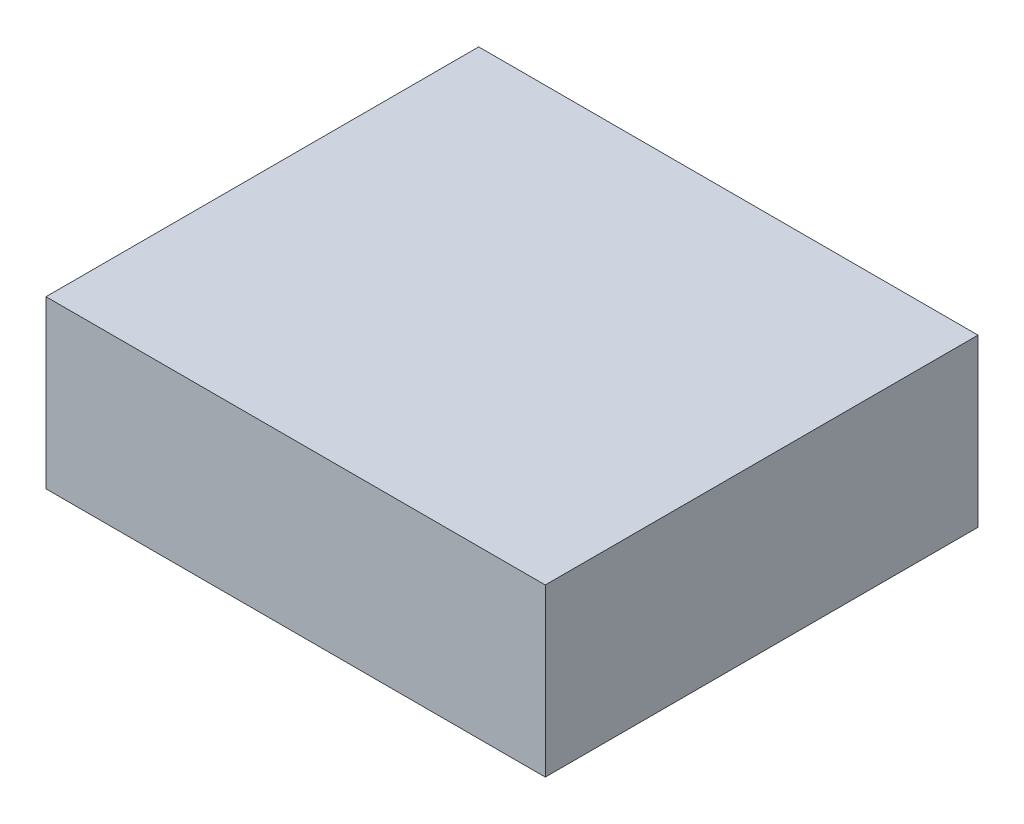
ISO-10303-21;
HEADER;
FILE_DESCRIPTION(('STEP AP214'),'2;1');
FILE_NAME('part.step','',(''),(''),'','','');
FILE_SCHEMA(('AUTOMOTIVE_DESIGN { 1 0 10303 214 1 1 1 1 }'));
ENDSEC;
DATA;
#1=APPLICATION_CONTEXT('core data for automotive mechanical design processes');
#2=APPLICATION_PROTOCOL_DEFINITION('international standard','automotive_design',2000,#1);
#3=PRODUCT_CONTEXT('',#1,'mechanical');
#4=PRODUCT('Part','Part','',(#3));
#5=PRODUCT_RELATED_PRODUCT_CATEGORY('part','',(#4));
#6=PRODUCT_DEFINITION_FORMATION('','',#4);
#7=PRODUCT_DEFINITION_CONTEXT('part definition',#1,'design');
#8=PRODUCT_DEFINITION('design','',#6,#7);
#9=PRODUCT_DEFINITION_SHAPE('','',#8);
#10=(LENGTH_UNIT() NAMED_UNIT(*) SI_UNIT(.MILLI.,.METRE.));
#11=(NAMED_UNIT(*) PLANE_ANGLE_UNIT() SI_UNIT($,.RADIAN.));
#12=(NAMED_UNIT(*) SI_UNIT($,.STERADIAN.) SOLID_ANGLE_UNIT());
#13=UNCERTAINTY_MEASURE_WITH_UNIT(LENGTH_MEASURE(1.E-05),#10,'distance_accuracy_value','');
#14=(GEOMETRIC_REPRESENTATION_CONTEXT(3) GLOBAL_UNCERTAINTY_ASSIGNED_CONTEXT((#13)) GLOBAL_UNIT_ASSIGNED_CONTEXT((#10,
#11,#12)) REPRESENTATION_CONTEXT('',''));
#15=CARTESIAN_POINT('',(0.,0.,0.));
#16=DIRECTION('',(0.,0.,1.));
#17=DIRECTION('',(1.,0.,0.));
#18=AXIS2_PLACEMENT_3D('',#15,#16,#17);
#19=CARTESIAN_POINT('',(30.,20.,26.));
#20=DIRECTION('',(-1.,0.,0.));
#21=DIRECTION('',(0.,0.,1.));
#22=AXIS2_PLACEMENT_3D('',#19,#20,#21);
#23=PLANE('',#22);
#24=DIRECTION('',(0.,0.,-1.));
#25=VECTOR('',#24,1.);
#26=CARTESIAN_POINT('',(30.,0.,26.));
#27=LINE('',#26,#25);
#28=CARTESIAN_POINT('',(30.,0.,26.));
#29=VERTEX_POINT('',#28);
#30=CARTESIAN_POINT('',(30.,0.,-26.));
#31=VERTEX_POINT('',#30);
#32=EDGE_CURVE('E96',#29,#31,#27,.T.);
#33=ORIENTED_EDGE('',*,*,#32,.T.);
#34=DIRECTION('',(0.,-1.,0.));
#35=VECTOR('',#34,1.);
#36=CARTESIAN_POINT('',(30.,20.,-26.));
#37=LINE('',#36,#35);
#38=CARTESIAN_POINT('',(30.,20.,-26.));
#39=VERTEX_POINT('',#38);
#40=EDGE_CURVE('E11',#39,#31,#37,.T.);
#41=ORIENTED_EDGE('',*,*,#40,.F.);
#42=DIRECTION('',(0.,0.,-1.));
#43=VECTOR('',#42,1.);
#44=CARTESIAN_POINT('',(30.,20.,26.));
#45=LINE('',#44,#43);
#46=CARTESIAN_POINT('',(30.,20.,26.));
#47=VERTEX_POINT('',#46);
#48=EDGE_CURVE('E84',#47,#39,#45,.T.);
#49=ORIENTED_EDGE('',*,*,#48,.F.);
#50=DIRECTION('',(0.,-1.,0.));
#51=VECTOR('',#50,1.);
#52=CARTESIAN_POINT('',(30.,20.,26.));
#53=LINE('',#52,#51);
#54=EDGE_CURVE('E92',#47,#29,#53,.T.);
#55=ORIENTED_EDGE('',*,*,#54,.T.);
#56=EDGE_LOOP('',(#33,#41,#49,#55));
#57=FACE_BOUND('',#56,.T.);
#58=ADVANCED_FACE('F33',(#57),#23,.F.);
#59=CARTESIAN_POINT('',(-30.,20.,-26.));
#60=DIRECTION('',(0.,0.,1.));
#61=DIRECTION('',(1.,0.,0.));
#62=AXIS2_PLACEMENT_3D('',#59,#60,#61);
#63=PLANE('',#62);
#64=DIRECTION('',(-1.,0.,0.));
#65=VECTOR('',#64,1.);
#66=CARTESIAN_POINT('',(-30.,0.,-26.));
#67=LINE('',#66,#65);
#68=CARTESIAN_POINT('',(-30.,0.,-26.));
#69=VERTEX_POINT('',#68);
#70=EDGE_CURVE('E88',#31,#69,#67,.T.);
#71=ORIENTED_EDGE('',*,*,#70,.T.);
#72=DIRECTION('',(0.,-1.,0.));
#73=VECTOR('',#72,1.);
#74=CARTESIAN_POINT('',(-30.,20.,-26.));
#75=LINE('',#74,#73);
#76=CARTESIAN_POINT('',(-30.,20.,-26.));
#77=VERTEX_POINT('',#76);
#78=EDGE_CURVE('E41',#77,#69,#75,.T.);
#79=ORIENTED_EDGE('',*,*,#78,.F.);
#80=DIRECTION('',(-1.,0.,0.));
#81=VECTOR('',#80,1.);
#82=CARTESIAN_POINT('',(-30.,20.,-26.));
#83=LINE('',#82,#81);
#84=EDGE_CURVE('E79',#39,#77,#83,.T.);
#85=ORIENTED_EDGE('',*,*,#84,.F.);
#86=ORIENTED_EDGE('',*,*,#40,.T.);
#87=EDGE_LOOP('',(#71,#79,#85,#86));
#88=FACE_BOUND('',#87,.T.);
#89=ADVANCED_FACE('F87',(#88),#63,.F.);
#90=CARTESIAN_POINT('',(-30.,20.,26.));
#91=DIRECTION('',(1.,0.,0.));
#92=DIRECTION('',(0.,0.,-1.));
#93=AXIS2_PLACEMENT_3D('',#90,#91,#92);
#94=PLANE('',#93);
#95=DIRECTION('',(0.,0.,1.));
#96=VECTOR('',#95,1.);
#97=CARTESIAN_POINT('',(-30.,0.,26.));
#98=LINE('',#97,#96);
#99=CARTESIAN_POINT('',(-30.,0.,26.));
#100=VERTEX_POINT('',#99);
#101=EDGE_CURVE('E66',#69,#100,#98,.T.);
#102=ORIENTED_EDGE('',*,*,#101,.T.);
#103=DIRECTION('',(0.,-1.,0.));
#104=VECTOR('',#103,1.);
#105=CARTESIAN_POINT('',(-30.,20.,26.));
#106=LINE('',#105,#104);
#107=CARTESIAN_POINT('',(-30.,20.,26.));
#108=VERTEX_POINT('',#107);
#109=EDGE_CURVE('E89',#108,#100,#106,.T.);
#110=ORIENTED_EDGE('',*,*,#109,.F.);
#111=DIRECTION('',(0.,0.,1.));
#112=VECTOR('',#111,1.);
#113=CARTESIAN_POINT('',(-30.,20.,26.));
#114=LINE('',#113,#112);
#115=EDGE_CURVE('E82',#77,#108,#114,.T.);
#116=ORIENTED_EDGE('',*,*,#115,.F.);
#117=ORIENTED_EDGE('',*,*,#78,.T.);
#118=EDGE_LOOP('',(#102,#110,#116,#117));
#119=FACE_BOUND('',#118,.T.);
#120=ADVANCED_FACE('F90',(#119),#94,.F.);
#121=CARTESIAN_POINT('',(-30.,20.,26.));
#122=DIRECTION('',(0.,0.,-1.));
#123=DIRECTION('',(-1.,0.,0.));
#124=AXIS2_PLACEMENT_3D('',#121,#122,#123);
#125=PLANE('',#124);
#126=DIRECTION('',(1.,0.,0.));
#127=VECTOR('',#126,1.);
#128=CARTESIAN_POINT('',(-30.,0.,26.));
#129=LINE('',#128,#127);
#130=EDGE_CURVE('E72',#100,#29,#129,.T.);
#131=ORIENTED_EDGE('',*,*,#130,.T.);
#132=ORIENTED_EDGE('',*,*,#54,.F.);
#133=DIRECTION('',(1.,0.,0.));
#134=VECTOR('',#133,1.);
#135=CARTESIAN_POINT('',(-30.,20.,26.));
#136=LINE('',#135,#134);
#137=EDGE_CURVE('E49',#108,#47,#136,.T.);
#138=ORIENTED_EDGE('',*,*,#137,.F.);
#139=ORIENTED_EDGE('',*,*,#109,.T.);
#140=EDGE_LOOP('',(#131,#132,#138,#139));
#141=FACE_BOUND('',#140,.T.);
#142=ADVANCED_FACE('F103',(#141),#125,.F.);
#143=CARTESIAN_POINT('',(0.,20.,0.));
#144=DIRECTION('',(0.,-1.,0.));
#145=DIRECTION('',(0.,0.,-1.));
#146=AXIS2_PLACEMENT_3D('',#143,#144,#145);
#147=PLANE('',#146);
#148=ORIENTED_EDGE('',*,*,#48,.T.);
#149=ORIENTED_EDGE('',*,*,#84,.T.);
#150=ORIENTED_EDGE('',*,*,#115,.T.);
#151=ORIENTED_EDGE('',*,*,#137,.T.);
#152=EDGE_LOOP('',(#148,#149,#150,#151));
#153=FACE_BOUND('',#152,.T.);
#154=ADVANCED_FACE('F80',(#153),#147,.F.);
#155=CARTESIAN_POINT('',(0.,0.,0.));
#156=DIRECTION('',(0.,-1.,0.));
#157=DIRECTION('',(0.,0.,-1.));
#158=AXIS2_PLACEMENT_3D('',#155,#156,#157);
#159=PLANE('',#158);
#160=ORIENTED_EDGE('',*,*,#32,.F.);
#161=ORIENTED_EDGE('',*,*,#130,.F.);
#162=ORIENTED_EDGE('',*,*,#101,.F.);
#163=ORIENTED_EDGE('',*,*,#70,.F.);
#164=EDGE_LOOP('',(#160,#161,#162,#163));
#165=FACE_BOUND('',#164,.T.);
#166=ADVANCED_FACE('F106',(#165),#159,.T.);
#167=CLOSED_SHELL('',(#58,#89,#120,#142,#154,#166));
#168=MANIFOLD_SOLID_BREP('B2',#167);
#169=ADVANCED_BREP_SHAPE_REPRESENTATION('',(#18,#168),#14);
#170=SHAPE_DEFINITION_REPRESENTATION(#9,#169);
ENDSEC;
END-ISO-10303-21;
